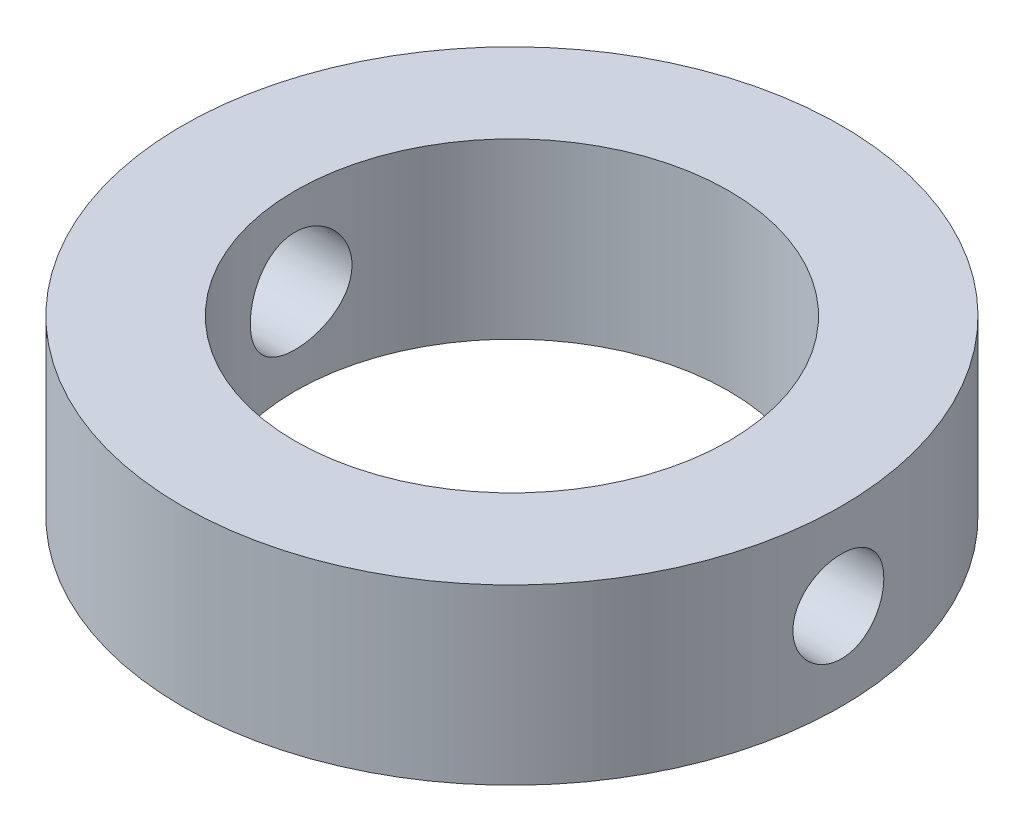
ISO-10303-21;
HEADER;
FILE_DESCRIPTION(('STEP AP214'),'2;1');
FILE_NAME('part.step','',(''),(''),'','','');
FILE_SCHEMA(('AUTOMOTIVE_DESIGN { 1 0 10303 214 1 1 1 1 }'));
ENDSEC;
DATA;
#1=APPLICATION_CONTEXT('core data for automotive mechanical design processes');
#2=APPLICATION_PROTOCOL_DEFINITION('international standard','automotive_design',2000,#1);
#3=PRODUCT_CONTEXT('',#1,'mechanical');
#4=PRODUCT('Part','Part','',(#3));
#5=PRODUCT_RELATED_PRODUCT_CATEGORY('part','',(#4));
#6=PRODUCT_DEFINITION_FORMATION('','',#4);
#7=PRODUCT_DEFINITION_CONTEXT('part definition',#1,'design');
#8=PRODUCT_DEFINITION('design','',#6,#7);
#9=PRODUCT_DEFINITION_SHAPE('','',#8);
#10=(LENGTH_UNIT() NAMED_UNIT(*) SI_UNIT(.MILLI.,.METRE.));
#11=(NAMED_UNIT(*) PLANE_ANGLE_UNIT() SI_UNIT($,.RADIAN.));
#12=(NAMED_UNIT(*) SI_UNIT($,.STERADIAN.) SOLID_ANGLE_UNIT());
#13=UNCERTAINTY_MEASURE_WITH_UNIT(LENGTH_MEASURE(1.E-05),#10,'distance_accuracy_value','');
#14=(GEOMETRIC_REPRESENTATION_CONTEXT(3) GLOBAL_UNCERTAINTY_ASSIGNED_CONTEXT((#13)) GLOBAL_UNIT_ASSIGNED_CONTEXT((#10,
#11,#12)) REPRESENTATION_CONTEXT('',''));
#15=CARTESIAN_POINT('',(0.,0.,0.));
#16=DIRECTION('',(0.,0.,1.));
#17=DIRECTION('',(1.,0.,0.));
#18=AXIS2_PLACEMENT_3D('',#15,#16,#17);
#19=CARTESIAN_POINT('',(0.,5.,0.));
#20=DIRECTION('',(0.,-1.,0.));
#21=DIRECTION('',(0.,0.,-1.));
#22=AXIS2_PLACEMENT_3D('',#19,#20,#21);
#23=CYLINDRICAL_SURFACE('',#22,19.);
#24=CARTESIAN_POINT('',(18.9026021300388,-1.78265865593161,-1.92136220256686));
#25=CARTESIAN_POINT('',(18.892443711811,-1.67508215564151,-2.02130369007678));
#26=CARTESIAN_POINT('',(18.882397853425,-1.55901925715287,-2.11224998639308));
#27=CARTESIAN_POINT('',(18.8636624284756,-1.3131377738008,-2.27351486993969));
#28=CARTESIAN_POINT('',(18.8549741778182,-1.18330604511493,-2.34381350107458));
#29=CARTESIAN_POINT('',(18.8399495066631,-0.91356135296742,-2.46167590379849));
#30=CARTESIAN_POINT('',(18.8336130301676,-0.773648629638271,-2.50924021672028));
#31=CARTESIAN_POINT('',(18.8240242418136,-0.487753859256837,-2.58019541968247));
#32=CARTESIAN_POINT('',(18.8207711553476,-0.341773346175871,-2.60359238116412));
#33=CARTESIAN_POINT('',(18.8177347478142,-0.0488994838890941,-2.62544896036755));
#34=CARTESIAN_POINT('',(18.8179284910758,0.0979813346756247,-2.62407341693346));
#35=CARTESIAN_POINT('',(18.8217071562663,0.389410472347104,-2.59682960810597));
#36=CARTESIAN_POINT('',(18.8252921367251,0.533958751152445,-2.570960919982));
#37=CARTESIAN_POINT('',(18.8354261916106,0.816179507742659,-2.49562521857172));
#38=CARTESIAN_POINT('',(18.8419662049338,0.953871586498357,-2.44623031952246));
#39=CARTESIAN_POINT('',(18.8572697703791,1.21903481229845,-2.32531103500783));
#40=CARTESIAN_POINT('',(18.8660334252448,1.34650548670388,-2.25378562696721));
#41=CARTESIAN_POINT('',(18.8848801185882,1.58865805769662,-2.09000610845306));
#42=CARTESIAN_POINT('',(18.8949726298006,1.70323599726003,-1.99759939233648));
#43=CARTESIAN_POINT('',(18.9152983768319,1.91533841585561,-1.79494677285523));
#44=CARTESIAN_POINT('',(18.9255316187324,2.01286215538942,-1.68470009631922));
#45=CARTESIAN_POINT('',(18.9450689965501,2.18875114798585,-1.44860635729931));
#46=CARTESIAN_POINT('',(18.9543663906285,2.26698255877599,-1.32265896083409));
#47=CARTESIAN_POINT('',(18.9709065267443,2.40118172780415,-1.05928859322089));
#48=CARTESIAN_POINT('',(18.9781493235883,2.45715007992755,-0.921865928303447));
#49=CARTESIAN_POINT('',(18.9897403754006,2.54501079125579,-0.639976636432611));
#50=CARTESIAN_POINT('',(18.9940994108717,2.57699288011385,-0.495538435956611));
#51=CARTESIAN_POINT('',(18.9994743317254,2.6162642104325,-0.20328505222974));
#52=CARTESIAN_POINT('',(19.0004903915924,2.62355474065326,-0.0554700456345485));
#53=CARTESIAN_POINT('',(18.9990705402971,2.6132646271793,0.238145036137616));
#54=CARTESIAN_POINT('',(18.9966607934866,2.59587249727421,0.383951887802399));
#55=CARTESIAN_POINT('',(18.9887051626256,2.53707602062538,0.670549502344591));
#56=CARTESIAN_POINT('',(18.9831592588863,2.4956715231314,0.811340233724782));
#57=CARTESIAN_POINT('',(18.9695410833264,2.39002397195025,1.0840586085133));
#58=CARTESIAN_POINT('',(18.9614669350914,2.32576395050474,1.21597958033283));
#59=CARTESIAN_POINT('',(18.9436845435221,2.17624111754308,1.46720721752807));
#60=CARTESIAN_POINT('',(18.9339762123259,2.09097717663744,1.58651320409757));
#61=CARTESIAN_POINT('',(18.913914423408,1.90106104008805,1.81012860419788));
#62=CARTESIAN_POINT('',(18.9035564692762,1.79626078545148,1.9143118994802));
#63=CARTESIAN_POINT('',(18.8834257926345,1.57063054682881,2.10364424179868));
#64=CARTESIAN_POINT('',(18.8736530812393,1.44980025854135,2.18879292741459));
#65=CARTESIAN_POINT('',(18.8557754564846,1.19514604843711,2.33781975365549));
#66=CARTESIAN_POINT('',(18.8476746844515,1.06129104236423,2.401645313818));
#67=CARTESIAN_POINT('',(18.8341038970689,0.784622488966939,2.5058553704734));
#68=CARTESIAN_POINT('',(18.8286337354438,0.641809440256152,2.54624117036616));
#69=CARTESIAN_POINT('',(18.8209906726232,0.352449626690017,2.60213545095604));
#70=CARTESIAN_POINT('',(18.8187927423506,0.205940013296241,2.61783282452731));
#71=CARTESIAN_POINT('',(18.8178689380073,-0.0876461031414214,2.62446606129986));
#72=CARTESIAN_POINT('',(18.8191429152332,-0.2347225816368,2.61540298500213));
#73=CARTESIAN_POINT('',(18.8249954405733,-0.524263745777771,2.57293466820195));
#74=CARTESIAN_POINT('',(18.8295524194829,-0.666752223073735,2.53968829737574));
#75=CARTESIAN_POINT('',(18.8414285305619,-0.944116402665104,2.45002054107456));
#76=CARTESIAN_POINT('',(18.8487477437461,-1.07899188154219,2.3935984758653));
#77=CARTESIAN_POINT('',(18.865364644321,-1.33799859481612,2.25889834659266));
#78=CARTESIAN_POINT('',(18.8746712342893,-1.46207782461005,2.18052142479612));
#79=CARTESIAN_POINT('',(18.8942028295557,-1.69540145137501,2.00423089308915));
#80=CARTESIAN_POINT('',(18.904427888338,-1.80464498350137,1.90631614504507));
#81=CARTESIAN_POINT('',(18.9247532019962,-2.00618797994572,1.6927196225496));
#82=CARTESIAN_POINT('',(18.934851593725,-2.09833154950798,1.5768905048361));
#83=CARTESIAN_POINT('',(18.9536994536529,-2.26189568710794,1.33132192505965));
#84=CARTESIAN_POINT('',(18.96244892157,-2.33331625081506,1.2015824600898));
#85=CARTESIAN_POINT('',(18.9776164355626,-2.45337789158702,0.93182811851803));
#86=CARTESIAN_POINT('',(18.9840345051526,-2.50201919840458,0.791813345569863));
#87=CARTESIAN_POINT('',(18.9938138905461,-2.57507547259801,0.505503593135367));
#88=CARTESIAN_POINT('',(18.9971754703262,-2.59949253213993,0.359209157140981));
#89=CARTESIAN_POINT('',(19.0004484909218,-2.6232726055247,0.065731626838784));
#90=CARTESIAN_POINT('',(19.0003870871034,-2.62283281445454,-0.0814352139363495));
#91=CARTESIAN_POINT('',(18.9968881427517,-2.59739806630398,-0.373619846238433));
#92=CARTESIAN_POINT('',(18.9934499884399,-2.57239864511525,-0.51863724220475));
#93=CARTESIAN_POINT('',(18.9835946595683,-2.49868861878149,-0.801998901097802));
#94=CARTESIAN_POINT('',(18.9771850243771,-2.45003800734352,-0.940359080032091));
#95=CARTESIAN_POINT('',(18.9621012594512,-2.3304856988967,-1.20686152111171));
#96=CARTESIAN_POINT('',(18.9534292282898,-2.25960461037704,-1.33501310958239));
#97=CARTESIAN_POINT('',(18.9375812129649,-2.12198109043238,-1.54120394665685));
#98=CARTESIAN_POINT('',(18.9307364210416,-2.06037142545263,-1.62274669490108));
#99=CARTESIAN_POINT('',(18.9167770075185,-1.92809389746798,-1.77809544871089));
#100=CARTESIAN_POINT('',(18.9096623829971,-1.85742593636623,-1.85190137047476));
#101=CARTESIAN_POINT('',(18.9026021300388,-1.78265865593161,-1.92136220256686));
#102=B_SPLINE_CURVE_WITH_KNOTS('',3,(#24,#25,#26,#27,#28,#29,#30,#31,#32,#33,#34,#35,#36,#37,
#38,#39,#40,#41,#42,#43,#44,#45,#46,#47,#48,#49,#50,#51,#52,#53,#54,#55,#56,#57,#58,#59,#60,#61,
#62,#63,#64,#65,#66,#67,#68,#69,#70,#71,#72,#73,#74,#75,#76,#77,#78,#79,#80,#81,#82,#83,#84,#85,
#86,#87,#88,#89,#90,#91,#92,#93,#94,#95,#96,#97,#98,#99,#100,#101),.UNSPECIFIED.,.T.,.F.,(4,2,2,
2,2,2,2,2,2,2,2,2,2,2,2,2,2,2,2,2,2,2,2,2,2,2,2,2,2,2,2,2,2,2,2,2,2,2,4),(0.,0.441195148760293,
0.882815322650266,1.32442498048317,1.76592366795585,2.20448566880274,2.64305523898976,
3.080289042095,3.51754305129881,3.95810235779809,4.3986807629443,4.84223477356564,
5.28577695122565,5.72765150071148,6.16950298648128,6.60799793619282,7.04649563881652,
7.48531956046381,7.92416708300834,8.36648668497696,8.80881468478946,9.25222550145437,
9.69561165929245,10.1355886428164,10.5755467822275,11.0126404687139,11.449746975907,
11.8888542180729,12.327987046949,12.77094528808,13.2139036217777,13.6568574876791,
14.0997730938266,14.5391754460635,14.978657681535,15.4170308958138,15.8549989168824,
16.1616328384739,16.4682700810389),.UNSPECIFIED.);
#103=CARTESIAN_POINT('',(18.9026021300388,-1.78265865593161,-1.92136220256686));
#104=VERTEX_POINT('',#103);
#105=EDGE_CURVE('E87',#104,#104,#102,.T.);
#106=ORIENTED_EDGE('',*,*,#105,.F.);
#107=EDGE_LOOP('',(#106));
#108=FACE_BOUND('',#107,.T.);
#109=CARTESIAN_POINT('',(0.,-5.,0.));
#110=DIRECTION('',(0.,1.,0.));
#111=DIRECTION('',(0.,0.,1.));
#112=AXIS2_PLACEMENT_3D('',#109,#110,#111);
#113=CIRCLE('',#112,19.);
#114=CARTESIAN_POINT('',(0.,-5.,19.));
#115=VERTEX_POINT('',#114);
#116=EDGE_CURVE('E57',#115,#115,#113,.T.);
#117=ORIENTED_EDGE('',*,*,#116,.T.);
#118=EDGE_LOOP('',(#117));
#119=FACE_BOUND('',#118,.T.);
#120=CARTESIAN_POINT('',(0.,5.,0.));
#121=DIRECTION('',(0.,1.,0.));
#122=DIRECTION('',(0.,0.,1.));
#123=AXIS2_PLACEMENT_3D('',#120,#121,#122);
#124=CIRCLE('',#123,19.);
#125=CARTESIAN_POINT('',(0.,5.,19.));
#126=VERTEX_POINT('',#125);
#127=EDGE_CURVE('E10',#126,#126,#124,.T.);
#128=ORIENTED_EDGE('',*,*,#127,.F.);
#129=EDGE_LOOP('',(#128));
#130=FACE_BOUND('',#129,.T.);
#131=CARTESIAN_POINT('',(-18.8737938076495,-2.05244291392491,-2.18629991225786));
#132=CARTESIAN_POINT('',(-18.8871187426754,-2.17517118494334,-2.07126012922134));
#133=CARTESIAN_POINT('',(-18.9005809028461,-2.28826221313472,-1.9458164867988));
#134=CARTESIAN_POINT('',(-18.9262750867144,-2.49193232263876,-1.67757501605887));
#135=CARTESIAN_POINT('',(-18.9385059576362,-2.58249042242739,-1.53476119632768));
#136=CARTESIAN_POINT('',(-18.9603615422286,-2.73841390833723,-1.23576984020848));
#137=CARTESIAN_POINT('',(-18.9699861222534,-2.8037780026277,-1.07959161905811));
#138=CARTESIAN_POINT('',(-18.9855409543933,-2.90732513952607,-0.758332304468777));
#139=CARTESIAN_POINT('',(-18.9914721639945,-2.9455152272128,-0.593253530517706));
#140=CARTESIAN_POINT('',(-18.9989405676526,-2.99336589557779,-0.260293458987292));
#141=CARTESIAN_POINT('',(-19.0005133150648,-3.00325733885791,-0.0924461410637738));
#142=CARTESIAN_POINT('',(-18.9991903201425,-2.99486243318517,0.242524908625466));
#143=CARTESIAN_POINT('',(-18.9962946061034,-2.97657626266084,0.409648644966389));
#144=CARTESIAN_POINT('',(-18.9863925019253,-2.91260387242268,0.737295542792538));
#145=CARTESIAN_POINT('',(-18.9794130608013,-2.8670972403377,0.897854661430866));
#146=CARTESIAN_POINT('',(-18.9621330470203,-2.75018919713658,1.20905752333384));
#147=CARTESIAN_POINT('',(-18.9518323277002,-2.67878664247537,1.35970082837624));
#148=CARTESIAN_POINT('',(-18.9289475257071,-2.51150981374726,1.64804238565058));
#149=CARTESIAN_POINT('',(-18.9163469950634,-2.41545709355178,1.78563577461334));
#150=CARTESIAN_POINT('',(-18.8902998494195,-2.2018307433186,2.04286972909237));
#151=CARTESIAN_POINT('',(-18.8768531760841,-2.08425562840497,2.16250905488245));
#152=CARTESIAN_POINT('',(-18.8504570396926,-1.82946661508816,2.38172529601009));
#153=CARTESIAN_POINT('',(-18.8375142210076,-1.6920607702032,2.48108007097114));
#154=CARTESIAN_POINT('',(-18.8137443624926,-1.40235938353494,2.65533181908211));
#155=CARTESIAN_POINT('',(-18.8029172916938,-1.25006405974164,2.73022915023253));
#156=CARTESIAN_POINT('',(-18.7846433805505,-0.935168601930464,2.85325386905908));
#157=CARTESIAN_POINT('',(-18.7771899093586,-0.772589404563423,2.90143381241831));
#158=CARTESIAN_POINT('',(-18.7665017961918,-0.441515469672513,2.96978524170327));
#159=CARTESIAN_POINT('',(-18.7632668302192,-0.273021187470898,2.98995887862928));
#160=CARTESIAN_POINT('',(-18.7614057168009,0.0631730273129059,3.0016143926437));
#161=CARTESIAN_POINT('',(-18.7627306851875,0.23086220554294,2.99340058949298));
#162=CARTESIAN_POINT('',(-18.7697274954078,0.562443446162834,2.94920683353168));
#163=CARTESIAN_POINT('',(-18.7753992961062,0.726335544470443,2.91322714347772));
#164=CARTESIAN_POINT('',(-18.7904231830146,1.04536874353858,2.81468535295521));
#165=CARTESIAN_POINT('',(-18.799767777537,1.20052692762297,2.7521773438156));
#166=CARTESIAN_POINT('',(-18.8210850877368,1.49819258459641,2.60239357400915));
#167=CARTESIAN_POINT('',(-18.8330579751202,1.64069923010821,2.51511619505498));
#168=CARTESIAN_POINT('',(-18.8584301917318,1.91053586040085,2.31724555924773));
#169=CARTESIAN_POINT('',(-18.8718424540821,2.03770185896685,2.20643030493494));
#170=CARTESIAN_POINT('',(-18.898497672061,2.27171101565988,1.96506903770753));
#171=CARTESIAN_POINT('',(-18.9117406204544,2.37855330800671,1.83452218466112));
#172=CARTESIAN_POINT('',(-18.9366595523392,2.56949748225151,1.55643706913307));
#173=CARTESIAN_POINT('',(-18.9483257290678,2.65346007450321,1.40880219977279));
#174=CARTESIAN_POINT('',(-18.9686799514546,2.79533439186554,1.10131338207101));
#175=CARTESIAN_POINT('',(-18.9773681638127,2.85324757522061,0.941460118300799));
#176=CARTESIAN_POINT('',(-18.9907262538947,2.94091889032179,0.615398317192401));
#177=CARTESIAN_POINT('',(-18.9954272216087,2.97089504215396,0.449249705397629));
#178=CARTESIAN_POINT('',(-19.0003949794096,3.00254646133788,0.114217481553419));
#179=CARTESIAN_POINT('',(-19.0006620708291,3.00422365192771,-0.0546659438533178));
#180=CARTESIAN_POINT('',(-18.9967529488185,2.97935706260914,-0.388565878971612));
#181=CARTESIAN_POINT('',(-18.9926215420664,2.95309786741068,-0.553604212257408));
#182=CARTESIAN_POINT('',(-18.9804435279554,2.87360263029636,-0.876895417607938));
#183=CARTESIAN_POINT('',(-18.9723968552658,2.82036613823278,-1.03514817639964));
#184=CARTESIAN_POINT('',(-18.9532460004571,2.68830553695632,-1.34090196867899));
#185=CARTESIAN_POINT('',(-18.9421334537904,2.60941131959424,-1.48837217159746));
#186=CARTESIAN_POINT('',(-18.9180772973303,2.42832481392852,-1.76807403461197));
#187=CARTESIAN_POINT('',(-18.9051335479351,2.32613074899766,-1.90030453151324));
#188=CARTESIAN_POINT('',(-18.8786752748271,2.09995915247372,-2.14738537028649));
#189=CARTESIAN_POINT('',(-18.8651558974934,1.97574451747388,-2.26201823865041));
#190=CARTESIAN_POINT('',(-18.8392013899061,1.70977987574485,-2.46888458871479));
#191=CARTESIAN_POINT('',(-18.8267662859575,1.56802944379023,-2.56111752707872));
#192=CARTESIAN_POINT('',(-18.804351412351,1.27041502043343,-2.72083107555993));
#193=CARTESIAN_POINT('',(-18.7943798536355,1.11450613860578,-2.78822926923296));
#194=CARTESIAN_POINT('',(-18.7781018208638,0.793397212341876,-2.8958380142058));
#195=CARTESIAN_POINT('',(-18.7717949843375,0.628198088557518,-2.93605125437745));
#196=CARTESIAN_POINT('',(-18.7636254335465,0.294873228740815,-2.98781690239953));
#197=CARTESIAN_POINT('',(-18.7617210251494,0.12679026670831,-2.99963824381517));
#198=CARTESIAN_POINT('',(-18.7624556611355,-0.209008263048595,-2.99503973280308));
#199=CARTESIAN_POINT('',(-18.765095358417,-0.376723774510796,-2.97861582209074));
#200=CARTESIAN_POINT('',(-18.7745800579658,-0.705871873137118,-2.91822823831588));
#201=CARTESIAN_POINT('',(-18.7813982298566,-0.867337613998114,-2.87444023756196));
#202=CARTESIAN_POINT('',(-18.7984379979584,-1.18051221589527,-2.76079792340987));
#203=CARTESIAN_POINT('',(-18.8086566735026,-1.33222931700389,-2.69096597277008));
#204=CARTESIAN_POINT('',(-18.8281397458813,-1.58092774724336,-2.5504195046257));
#205=CARTESIAN_POINT('',(-18.8368608516587,-1.68128090249065,-2.48550524185248));
#206=CARTESIAN_POINT('',(-18.8549628947784,-1.87351946577381,-2.34423830088692));
#207=CARTESIAN_POINT('',(-18.8643438420885,-1.96540474584137,-2.26788544987799));
#208=CARTESIAN_POINT('',(-18.8737938076495,-2.05244291392491,-2.18629991225786));
#209=B_SPLINE_CURVE_WITH_KNOTS('',3,(#131,#132,#133,#134,#135,#136,#137,#138,#139,#140,#141,
#142,#143,#144,#145,#146,#147,#148,#149,#150,#151,#152,#153,#154,#155,#156,#157,#158,#159,#160,
#161,#162,#163,#164,#165,#166,#167,#168,#169,#170,#171,#172,#173,#174,#175,#176,#177,#178,#179,
#180,#181,#182,#183,#184,#185,#186,#187,#188,#189,#190,#191,#192,#193,#194,#195,#196,#197,#198,
#199,#200,#201,#202,#203,#204,#205,#206,#207,#208),.UNSPECIFIED.,.T.,.F.,(4,2,2,2,2,2,2,2,2,2,2,
2,2,2,2,2,2,2,2,2,2,2,2,2,2,2,2,2,2,2,2,2,2,2,2,2,2,2,4),(0.,0.505797065096929,1.01206335505242,
1.51835560052279,2.02451653780113,2.52653623288538,3.02855274905388,3.52729317583884,
4.0260556293198,4.52853588389419,5.03105081872857,5.53880418818166,6.04655012496465,
6.553293700972,7.05999835482127,7.56128794578586,8.06257279296027,8.56284039260264,
9.06314068436323,9.56838756051733,10.07365595513,10.5819349412163,11.0901854703311,
11.5944355679359,12.0986513958413,12.5977795810538,13.0969160950772,13.5974280919118,
14.0979782658549,14.6042875668817,15.1106091478072,15.618596186229,16.1265329721474,
16.6296391710876,17.1328176624867,17.632798566595,18.1323511445068,18.4910540287502,
18.8497623328984),.UNSPECIFIED.);
#210=CARTESIAN_POINT('',(-18.8737938076495,-2.05244291392491,-2.18629991225786));
#211=VERTEX_POINT('',#210);
#212=EDGE_CURVE('E93',#211,#211,#209,.T.);
#213=ORIENTED_EDGE('',*,*,#212,.F.);
#214=EDGE_LOOP('',(#213));
#215=FACE_BOUND('',#214,.T.);
#216=ADVANCED_FACE('F43',(#108,#119,#130,#215),#23,.T.);
#217=CARTESIAN_POINT('',(0.,5.,0.));
#218=DIRECTION('',(0.,-1.,0.));
#219=DIRECTION('',(0.,0.,-1.));
#220=AXIS2_PLACEMENT_3D('',#217,#218,#219);
#221=CYLINDRICAL_SURFACE('',#220,12.5);
#222=CARTESIAN_POINT('',(12.3454692335171,-1.83797069776759,-1.95943599137191));
#223=CARTESIAN_POINT('',(12.3291540697057,-1.72861352263705,-2.06223215091232));
#224=CARTESIAN_POINT('',(12.312969484364,-1.61057051883178,-2.15589893011807));
#225=CARTESIAN_POINT('',(12.2826685261875,-1.36024652258467,-2.32233632028877));
#226=CARTESIAN_POINT('',(12.2685534727468,-1.22795653963181,-2.39509362891389));
#227=CARTESIAN_POINT('',(12.2440113019338,-0.952664038613042,-2.51756025599985));
#228=CARTESIAN_POINT('',(12.2335864508035,-0.809655002809349,-2.56725541724607));
#229=CARTESIAN_POINT('',(12.2176788230151,-0.517084492550406,-2.64193132692203));
#230=CARTESIAN_POINT('',(12.2121947212405,-0.367524786285842,-2.66691870219302));
#231=CARTESIAN_POINT('',(12.2068743291519,-0.0686688906625418,-2.69116553670252));
#232=CARTESIAN_POINT('',(12.2069483399379,0.0805926151139879,-2.6908336069778));
#233=CARTESIAN_POINT('',(12.2125113510825,0.376895356855329,-2.66547001468287));
#234=CARTESIAN_POINT('',(12.2180002939712,0.523936616367311,-2.64043861425384));
#235=CARTESIAN_POINT('',(12.2336819112731,0.810448263976614,-2.56679075645022));
#236=CARTESIAN_POINT('',(12.2438366046149,0.949969808324846,-2.51836458117403));
#237=CARTESIAN_POINT('',(12.2676882691179,1.2189556651788,-2.39947522721528));
#238=CARTESIAN_POINT('',(12.2813856135891,1.34841891591209,-2.3290097259551));
#239=CARTESIAN_POINT('',(12.3110877830158,1.59614188157373,-2.16657183666619));
#240=CARTESIAN_POINT('',(12.3271295640119,1.7141592152199,-2.07423662581472));
#241=CARTESIAN_POINT('',(12.359563712391,1.93322119822237,-1.87128933137262));
#242=CARTESIAN_POINT('',(12.3759561183317,2.03426396998352,-1.76067522859272));
#243=CARTESIAN_POINT('',(12.4075734623279,2.21820531640723,-1.52210782621818));
#244=CARTESIAN_POINT('',(12.4227744498213,2.30077418214844,-1.39389674982004));
#245=CARTESIAN_POINT('',(12.4499941926911,2.44318895028559,-1.12510703447397));
#246=CARTESIAN_POINT('',(12.4620131527031,2.50303631400511,-0.984529191605803));
#247=CARTESIAN_POINT('',(12.4814224367189,2.59774345744312,-0.69625124609618));
#248=CARTESIAN_POINT('',(12.488852361027,2.63281740450599,-0.548624269469743));
#249=CARTESIAN_POINT('',(12.4984070366178,2.67768168298208,-0.249415704708787));
#250=CARTESIAN_POINT('',(12.500532479223,2.68747530913404,-0.0978346345054567));
#251=CARTESIAN_POINT('',(12.4992509416069,2.68151850601796,0.20193372181783));
#252=CARTESIAN_POINT('',(12.4959473270894,2.66624533929634,0.350131190802689));
#253=CARTESIAN_POINT('',(12.484366678369,2.6115479613479,0.641792289253492));
#254=CARTESIAN_POINT('',(12.4760896155806,2.57212361130977,0.785255891506078));
#255=CARTESIAN_POINT('',(12.4554550976787,2.47031372991546,1.0635486509958));
#256=CARTESIAN_POINT('',(12.4430954730474,2.40791598822395,1.19837317174861));
#257=CARTESIAN_POINT('',(12.4156197122548,2.26196587760522,1.45573295761619));
#258=CARTESIAN_POINT('',(12.4005032412873,2.1784109387547,1.57826672727128));
#259=CARTESIAN_POINT('',(12.3688174505395,1.99063332214228,1.81006001051002));
#260=CARTESIAN_POINT('',(12.3522259506275,1.88604746221162,1.9190224032969));
#261=CARTESIAN_POINT('',(12.3196756382794,1.66005977478064,2.11796558259558));
#262=CARTESIAN_POINT('',(12.3037168696549,1.53865678543722,2.20794505655205));
#263=CARTESIAN_POINT('',(12.2741031071834,1.28118282441046,2.36707035960545));
#264=CARTESIAN_POINT('',(12.2604686058057,1.14499713564621,2.43603470932705));
#265=CARTESIAN_POINT('',(12.2372788741433,0.862613061677949,2.54998258346632));
#266=CARTESIAN_POINT('',(12.2277230994905,0.716416015665986,2.59496930826184));
#267=CARTESIAN_POINT('',(12.2139702835494,0.420806715461771,2.65894585163189));
#268=CARTESIAN_POINT('',(12.2096847269612,0.271491661152016,2.67836548382858));
#269=CARTESIAN_POINT('',(12.2066932217019,-0.0283309828890449,2.69196857984738));
#270=CARTESIAN_POINT('',(12.2079866474594,-0.178838437027558,2.68615487308357));
#271=CARTESIAN_POINT('',(12.2159247489285,-0.474046597040349,2.64981295736896));
#272=CARTESIAN_POINT('',(12.2224770481631,-0.618802647288225,2.61971133767266));
#273=CARTESIAN_POINT('',(12.240058895281,-0.901170139999346,2.53628858987085));
#274=CARTESIAN_POINT('',(12.2510887154073,-1.03878114745441,2.48296604986822));
#275=CARTESIAN_POINT('',(12.2765060882778,-1.30441483764154,2.35408812840338));
#276=CARTESIAN_POINT('',(12.2909239512469,-1.43233630329804,2.27833034219399));
#277=CARTESIAN_POINT('',(12.3214661565747,-1.67383354775509,2.10690091563364));
#278=CARTESIAN_POINT('',(12.3375907301527,-1.78740737820407,2.01122657535509));
#279=CARTESIAN_POINT('',(12.3701538841778,-1.9995368480303,1.80025084523445));
#280=CARTESIAN_POINT('',(12.3865917770971,-2.09771788008877,1.68457231013463));
#281=CARTESIAN_POINT('',(12.4176080107903,-2.27335291428529,1.43819455390302));
#282=CARTESIAN_POINT('',(12.4321863264947,-2.35080663700791,1.30749513031541));
#283=CARTESIAN_POINT('',(12.4578815606724,-2.48284492457119,1.03441019405134));
#284=CARTESIAN_POINT('',(12.4689926573026,-2.53739107760964,0.892005528023211));
#285=CARTESIAN_POINT('',(12.4864598211699,-2.6217070022808,0.599769122108534));
#286=CARTESIAN_POINT('',(12.4928166359967,-2.65148066936007,0.449938553864745));
#287=CARTESIAN_POINT('',(12.4999808127382,-2.68495989823976,0.15013124794409));
#288=CARTESIAN_POINT('',(12.5008905917383,-2.68914658693727,0.000210578643851963));
#289=CARTESIAN_POINT('',(12.4973334128608,-2.67259698451915,-0.298198188744533));
#290=CARTESIAN_POINT('',(12.4928660521235,-2.65185882601312,-0.446686178654926));
#291=CARTESIAN_POINT('',(12.4791134905774,-2.58643021412455,-0.736630771498514));
#292=CARTESIAN_POINT('',(12.4698717321153,-2.5419556203042,-0.878138379674458));
#293=CARTESIAN_POINT('',(12.4475933368112,-2.43055183536252,-1.15162381152576));
#294=CARTESIAN_POINT('',(12.4345587769118,-2.36363493062501,-1.28360680165842));
#295=CARTESIAN_POINT('',(12.4088458839216,-2.22425151833839,-1.51028349513468));
#296=CARTESIAN_POINT('',(12.3965868584878,-2.15536568163035,-1.60725036376825));
#297=CARTESIAN_POINT('',(12.3713477829111,-2.00545342044804,-1.79119245682315));
#298=CARTESIAN_POINT('',(12.3583677011884,-1.92442646397148,-1.87816724311398));
#299=CARTESIAN_POINT('',(12.3454692335171,-1.83797069776759,-1.95943599137191));
#300=B_SPLINE_CURVE_WITH_KNOTS('',3,(#222,#223,#224,#225,#226,#227,#228,#229,#230,#231,#232,
#233,#234,#235,#236,#237,#238,#239,#240,#241,#242,#243,#244,#245,#246,#247,#248,#249,#250,#251,
#252,#253,#254,#255,#256,#257,#258,#259,#260,#261,#262,#263,#264,#265,#266,#267,#268,#269,#270,
#271,#272,#273,#274,#275,#276,#277,#278,#279,#280,#281,#282,#283,#284,#285,#286,#287,#288,#289,
#290,#291,#292,#293,#294,#295,#296,#297,#298,#299),.UNSPECIFIED.,.T.,.F.,(4,2,2,2,2,2,2,2,2,2,2,
2,2,2,2,2,2,2,2,2,2,2,2,2,2,2,2,2,2,2,2,2,2,2,2,2,2,2,4),(0.,0.452492233156446,
0.905271702079001,1.35832875332291,1.81126425777243,2.25689171545705,2.7025144436454,
3.14457219682272,3.5866765512244,4.03670452770799,4.4867822500869,4.94434532688738,
5.40187897072925,5.85540713020465,6.30887617918633,6.75381108023749,7.19874853861983,
7.6439228230229,8.08915120783621,8.54285569436431,8.99659154157036,9.45414136503365,
9.91163010241115,10.3613253119949,10.8109700985613,11.2528849672487,11.6948267093529,
12.1408837360406,12.5870012705276,13.0426927698846,13.4983904119019,13.954849153664,
14.4112361042111,14.8590142628721,15.3068259715387,15.7506329809511,16.1941974170249,
16.5519137539016,16.9096457698589),.UNSPECIFIED.);
#301=CARTESIAN_POINT('',(12.3454692335171,-1.83797069776759,-1.95943599137191));
#302=VERTEX_POINT('',#301);
#303=EDGE_CURVE('E68',#302,#302,#300,.T.);
#304=ORIENTED_EDGE('',*,*,#303,.T.);
#305=EDGE_LOOP('',(#304));
#306=FACE_BOUND('',#305,.T.);
#307=CARTESIAN_POINT('',(0.,5.,0.));
#308=DIRECTION('',(0.,1.,0.));
#309=DIRECTION('',(0.,0.,1.));
#310=AXIS2_PLACEMENT_3D('',#307,#308,#309);
#311=CIRCLE('',#310,12.5);
#312=CARTESIAN_POINT('',(0.,5.,12.5));
#313=VERTEX_POINT('',#312);
#314=EDGE_CURVE('E63',#313,#313,#311,.T.);
#315=ORIENTED_EDGE('',*,*,#314,.T.);
#316=EDGE_LOOP('',(#315));
#317=FACE_BOUND('',#316,.T.);
#318=CARTESIAN_POINT('',(0.,-5.,0.));
#319=DIRECTION('',(0.,1.,0.));
#320=DIRECTION('',(0.,0.,1.));
#321=AXIS2_PLACEMENT_3D('',#318,#319,#320);
#322=CIRCLE('',#321,12.5);
#323=CARTESIAN_POINT('',(0.,-5.,12.5));
#324=VERTEX_POINT('',#323);
#325=EDGE_CURVE('E66',#324,#324,#322,.T.);
#326=ORIENTED_EDGE('',*,*,#325,.F.);
#327=EDGE_LOOP('',(#326));
#328=FACE_BOUND('',#327,.T.);
#329=CARTESIAN_POINT('',(-12.3171113013014,-2.01611596562805,-2.1304387321286));
#330=CARTESIAN_POINT('',(-12.3366161673235,-2.13556419827197,-2.01766317211899));
#331=CARTESIAN_POINT('',(-12.3562661939276,-2.24555495089836,-1.89480673568672));
#332=CARTESIAN_POINT('',(-12.393691926839,-2.44357911943809,-1.63217115331813));
#333=CARTESIAN_POINT('',(-12.4114665211358,-2.53159955013417,-1.49238207174991));
#334=CARTESIAN_POINT('',(-12.4431817775013,-2.68312766230613,-1.19954250371609));
#335=CARTESIAN_POINT('',(-12.4571198042988,-2.74661850685878,-1.04648299645216));
#336=CARTESIAN_POINT('',(-12.4795744970057,-2.84696629848501,-0.731515131349141));
#337=CARTESIAN_POINT('',(-12.4880926470897,-2.88383053734046,-0.569609209203553));
#338=CARTESIAN_POINT('',(-12.4986449818105,-2.92929258171351,-0.244608972845456));
#339=CARTESIAN_POINT('',(-12.5007917690147,-2.93838135633344,-0.0815869830932473));
#340=CARTESIAN_POINT('',(-12.4986828916998,-2.92937559473237,0.243656994929957));
#341=CARTESIAN_POINT('',(-12.4944275604449,-2.91128247347308,0.405879024402107));
#342=CARTESIAN_POINT('',(-12.480088638803,-2.84895782039813,0.722635358835208));
#343=CARTESIAN_POINT('',(-12.4700850600059,-2.80508493915471,0.877244190324639));
#344=CARTESIAN_POINT('',(-12.4453816474879,-2.69286538365249,1.1769025315934));
#345=CARTESIAN_POINT('',(-12.430681400882,-2.62451655764477,1.32195119958407));
#346=CARTESIAN_POINT('',(-12.3978666132785,-2.46405611769489,1.60092565047313));
#347=CARTESIAN_POINT('',(-12.3797015416436,-2.37158424974442,1.7346381247589));
#348=CARTESIAN_POINT('',(-12.3420523513758,-2.16596543972935,1.9848893273665));
#349=CARTESIAN_POINT('',(-12.3225680297493,-2.05281531132192,2.10142540394614));
#350=CARTESIAN_POINT('',(-12.2839325020854,-1.80601781363724,2.3167346987976));
#351=CARTESIAN_POINT('',(-12.2647987690278,-1.6719650910999,2.41504709196838));
#352=CARTESIAN_POINT('',(-12.2295150834944,-1.38891208848293,2.58781098216268));
#353=CARTESIAN_POINT('',(-12.213365041278,-1.239912258176,2.66226319687906));
#354=CARTESIAN_POINT('',(-12.1860095573152,-0.931700990720815,2.78480198084085));
#355=CARTESIAN_POINT('',(-12.1747842670042,-0.772533562957807,2.83299457982371));
#356=CARTESIAN_POINT('',(-12.1585501626244,-0.448057434337061,2.90188427919768));
#357=CARTESIAN_POINT('',(-12.1535402017024,-0.282749872257072,2.92258645217415));
#358=CARTESIAN_POINT('',(-12.1503952264396,0.0450030385689528,2.93563196036343));
#359=CARTESIAN_POINT('',(-12.1520959096455,0.207420170832747,2.92865301412624));
#360=CARTESIAN_POINT('',(-12.1617986640568,0.528696362166204,2.88809270379177));
#361=CARTESIAN_POINT('',(-12.1698006157716,0.687555488647444,2.85451184414546));
#362=CARTESIAN_POINT('',(-12.1911084268962,0.99642826823429,2.76208062161065));
#363=CARTESIAN_POINT('',(-12.2043861227826,1.14648411128719,2.70336431262505));
#364=CARTESIAN_POINT('',(-12.2347511338663,1.43470088939968,2.5624281410417));
#365=CARTESIAN_POINT('',(-12.2518389636711,1.57286021418493,2.48020510313578));
#366=CARTESIAN_POINT('',(-12.2883719806417,1.83667119926907,2.29243044097098));
#367=CARTESIAN_POINT('',(-12.3078610920067,1.96197695398769,2.18640129186677));
#368=CARTESIAN_POINT('',(-12.3467373513922,2.19321091099608,1.954948197745));
#369=CARTESIAN_POINT('',(-12.3661244884061,2.29913706160714,1.82952220181408));
#370=CARTESIAN_POINT('',(-12.4029530591681,2.49012177085635,1.56058110141842));
#371=CARTESIAN_POINT('',(-12.4203619000512,2.57485257755566,1.41682832727034));
#372=CARTESIAN_POINT('',(-12.4509349387827,2.71884162760698,1.1166660124989));
#373=CARTESIAN_POINT('',(-12.4640996372466,2.7781028754831,0.96025796734641));
#374=CARTESIAN_POINT('',(-12.4845133568539,2.86850299659556,0.641839610463454));
#375=CARTESIAN_POINT('',(-12.4918532080945,2.90007450626707,0.479958106810586));
#376=CARTESIAN_POINT('',(-12.5001317537463,2.93561494485099,0.153040845531211));
#377=CARTESIAN_POINT('',(-12.5010714081794,2.93958801349777,-0.0119944353081782));
#378=CARTESIAN_POINT('',(-12.4964977547571,2.92002624068472,-0.336643448927608));
#379=CARTESIAN_POINT('',(-12.4911269956018,2.89709907671126,-0.496296276376065));
#380=CARTESIAN_POINT('',(-12.4747524475997,2.82549043614352,-0.809407989763727));
#381=CARTESIAN_POINT('',(-12.4637485125392,2.77680829105661,-0.962866714818406));
#382=CARTESIAN_POINT('',(-12.4372255598423,2.65493038081476,-1.26007972571455));
#383=CARTESIAN_POINT('',(-12.4216868108141,2.58162727265977,-1.40378814568074));
#384=CARTESIAN_POINT('',(-12.3877572767493,2.41267430917259,-1.67703708133936));
#385=CARTESIAN_POINT('',(-12.3693660555185,2.31702103496248,-1.80657542499702));
#386=CARTESIAN_POINT('',(-12.3311946031091,2.10332475297951,-2.051184707351));
#387=CARTESIAN_POINT('',(-12.3113913665113,1.98479010389215,-2.16582284088428));
#388=CARTESIAN_POINT('',(-12.2729987972273,1.73009406524257,-2.37375426371707));
#389=CARTESIAN_POINT('',(-12.2544095539416,1.59393137971779,-2.46704598229265));
#390=CARTESIAN_POINT('',(-12.220392823907,1.30627927250131,-2.63040923183599));
#391=CARTESIAN_POINT('',(-12.2049955444027,1.15466203552396,-2.70026247487083));
#392=CARTESIAN_POINT('',(-12.1794180196024,0.841407314689627,-2.81339105072166));
#393=CARTESIAN_POINT('',(-12.1692368319017,0.679771646808328,-2.85667118485075));
#394=CARTESIAN_POINT('',(-12.1554867635775,0.354567550490224,-2.91462173609596));
#395=CARTESIAN_POINT('',(-12.1517878718376,0.191104933809911,-2.92985499486855));
#396=CARTESIAN_POINT('',(-12.1510498980631,-0.136101755593035,-2.93291537484556));
#397=CARTESIAN_POINT('',(-12.1540108671758,-0.2998458304676,-2.9207422855709));
#398=CARTESIAN_POINT('',(-12.1661264080885,-0.620052910768614,-2.86984695680378));
#399=CARTESIAN_POINT('',(-12.175175760876,-0.776592116102986,-2.83157559576668));
#400=CARTESIAN_POINT('',(-12.1983141317551,-1.08093217889025,-2.73016787835941));
#401=CARTESIAN_POINT('',(-12.2124008366744,-1.22873701096094,-2.66704293351284));
#402=CARTESIAN_POINT('',(-12.2413608805364,-1.48784285435813,-2.53042913336647));
#403=CARTESIAN_POINT('',(-12.2557001101164,-1.60109437093892,-2.46048804926661));
#404=CARTESIAN_POINT('',(-12.285698372372,-1.81699291305534,-2.30603694622578));
#405=CARTESIAN_POINT('',(-12.3013574885663,-1.91963926660953,-2.22152600499035));
#406=CARTESIAN_POINT('',(-12.3171113013014,-2.01611596562805,-2.1304387321286));
#407=B_SPLINE_CURVE_WITH_KNOTS('',3,(#329,#330,#331,#332,#333,#334,#335,#336,#337,#338,#339,
#340,#341,#342,#343,#344,#345,#346,#347,#348,#349,#350,#351,#352,#353,#354,#355,#356,#357,#358,
#359,#360,#361,#362,#363,#364,#365,#366,#367,#368,#369,#370,#371,#372,#373,#374,#375,#376,#377,
#378,#379,#380,#381,#382,#383,#384,#385,#386,#387,#388,#389,#390,#391,#392,#393,#394,#395,#396,
#397,#398,#399,#400,#401,#402,#403,#404,#405,#406),.UNSPECIFIED.,.T.,.F.,(4,2,2,2,2,2,2,2,2,2,2,
2,2,2,2,2,2,2,2,2,2,2,2,2,2,2,2,2,2,2,2,2,2,2,2,2,2,2,4),(0.,0.495815206194529,
0.991922766038483,1.48837024794638,1.98468172450999,2.47216794065118,2.95962878143125,
3.4404634187727,3.9213403380165,4.40985662858851,4.89844825890565,5.39807914367409,
5.89769499858109,6.39527829257803,6.8927697588008,7.37815720934578,7.86353545572916,
8.34635668727362,8.82924316954591,9.32285348714184,9.81651603204263,10.317396471759,
10.8182178087361,11.3110670668592,11.8038423965643,12.2856968651563,12.7675638413081,
13.251559546494,13.7356293364435,14.2315727490363,14.7275526426897,15.2280311973622,
15.7284192973595,16.2186513877563,16.7088872431186,17.1908613685114,17.6726144530649,
18.0730522362985,18.4735153771759),.UNSPECIFIED.);
#408=CARTESIAN_POINT('',(-12.3171113013014,-2.01611596562805,-2.1304387321286));
#409=VERTEX_POINT('',#408);
#410=EDGE_CURVE('E47',#409,#409,#407,.T.);
#411=ORIENTED_EDGE('',*,*,#410,.T.);
#412=EDGE_LOOP('',(#411));
#413=FACE_BOUND('',#412,.T.);
#414=ADVANCED_FACE('F74',(#306,#317,#328,#413),#221,.F.);
#415=CARTESIAN_POINT('',(0.,5.,0.));
#416=DIRECTION('',(0.,1.,0.));
#417=DIRECTION('',(0.,0.,1.));
#418=AXIS2_PLACEMENT_3D('',#415,#416,#417);
#419=PLANE('',#418);
#420=ORIENTED_EDGE('',*,*,#127,.T.);
#421=EDGE_LOOP('',(#420));
#422=FACE_BOUND('',#421,.T.);
#423=ORIENTED_EDGE('',*,*,#314,.F.);
#424=EDGE_LOOP('',(#423));
#425=FACE_BOUND('',#424,.T.);
#426=ADVANCED_FACE('F111',(#422,#425),#419,.T.);
#427=CARTESIAN_POINT('',(0.,-5.,0.));
#428=DIRECTION('',(0.,1.,0.));
#429=DIRECTION('',(0.,0.,1.));
#430=AXIS2_PLACEMENT_3D('',#427,#428,#429);
#431=PLANE('',#430);
#432=ORIENTED_EDGE('',*,*,#116,.F.);
#433=EDGE_LOOP('',(#432));
#434=FACE_BOUND('',#433,.T.);
#435=ORIENTED_EDGE('',*,*,#325,.T.);
#436=EDGE_LOOP('',(#435));
#437=FACE_BOUND('',#436,.T.);
#438=ADVANCED_FACE('F107',(#434,#437),#431,.F.);
#439=CARTESIAN_POINT('',(19.,0.,0.));
#440=DIRECTION('',(-1.,0.,0.));
#441=DIRECTION('',(0.,0.,1.));
#442=AXIS2_PLACEMENT_3D('',#439,#440,#441);
#443=CONICAL_SURFACE('',#442,2.62,0.00999966668666524);
#444=ORIENTED_EDGE('',*,*,#303,.F.);
#445=EDGE_LOOP('',(#444));
#446=FACE_BOUND('',#445,.T.);
#447=ORIENTED_EDGE('',*,*,#105,.T.);
#448=EDGE_LOOP('',(#447));
#449=FACE_BOUND('',#448,.T.);
#450=ADVANCED_FACE('F80',(#446,#449),#443,.F.);
#451=ORIENTED_EDGE('',*,*,#410,.F.);
#452=EDGE_LOOP('',(#451));
#453=FACE_BOUND('',#452,.T.);
#454=ORIENTED_EDGE('',*,*,#212,.T.);
#455=EDGE_LOOP('',(#454));
#456=FACE_BOUND('',#455,.T.);
#457=ADVANCED_FACE('F77',(#453,#456),#443,.F.);
#458=CLOSED_SHELL('',(#216,#414,#426,#438,#450,#457));
#459=MANIFOLD_SOLID_BREP('B2',#458);
#460=ADVANCED_BREP_SHAPE_REPRESENTATION('',(#18,#459),#14);
#461=SHAPE_DEFINITION_REPRESENTATION(#9,#460);
ENDSEC;
END-ISO-10303-21;
